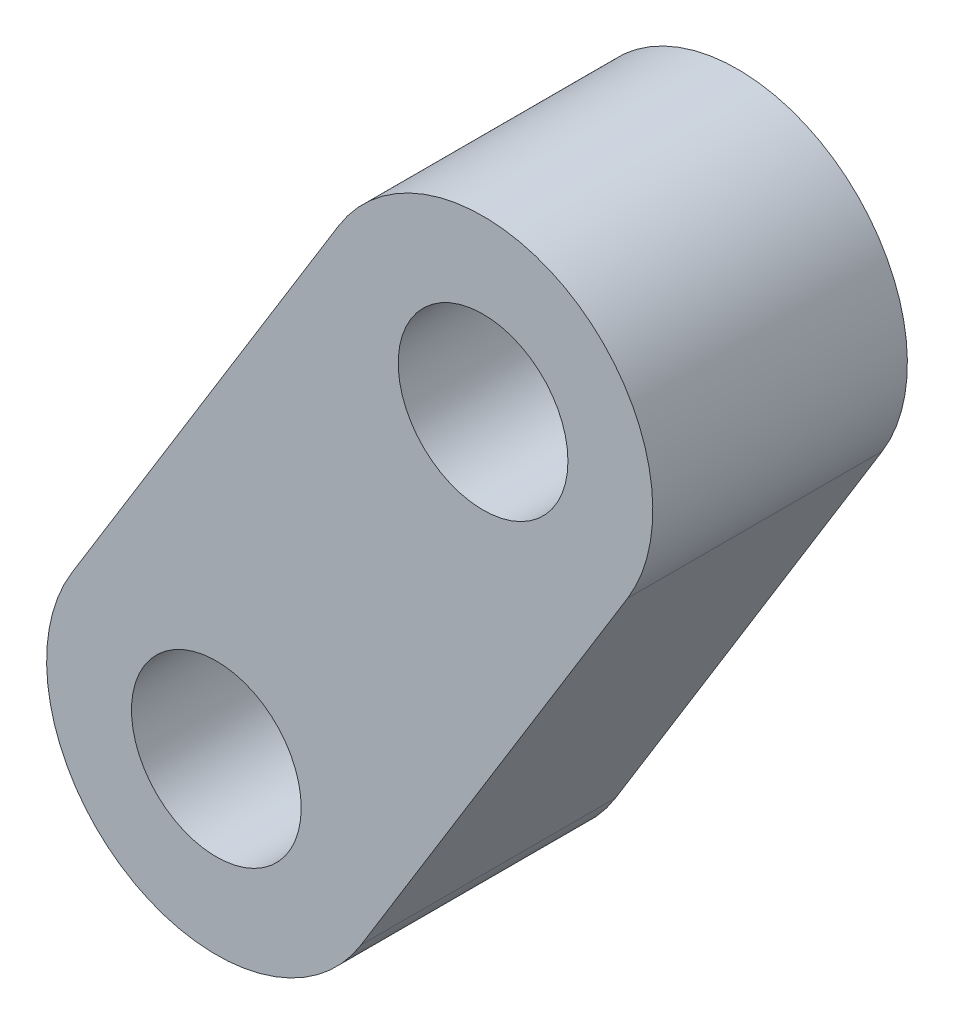
ISO-10303-21;
HEADER;
FILE_DESCRIPTION(('STEP AP214'),'2;1');
FILE_NAME('part.step','',(''),(''),'','','');
FILE_SCHEMA(('AUTOMOTIVE_DESIGN { 1 0 10303 214 1 1 1 1 }'));
ENDSEC;
DATA;
#1=APPLICATION_CONTEXT('core data for automotive mechanical design processes');
#2=APPLICATION_PROTOCOL_DEFINITION('international standard','automotive_design',2000,#1);
#3=PRODUCT_CONTEXT('',#1,'mechanical');
#4=PRODUCT('Part','Part','',(#3));
#5=PRODUCT_RELATED_PRODUCT_CATEGORY('part','',(#4));
#6=PRODUCT_DEFINITION_FORMATION('','',#4);
#7=PRODUCT_DEFINITION_CONTEXT('part definition',#1,'design');
#8=PRODUCT_DEFINITION('design','',#6,#7);
#9=PRODUCT_DEFINITION_SHAPE('','',#8);
#10=(LENGTH_UNIT() NAMED_UNIT(*) SI_UNIT(.MILLI.,.METRE.));
#11=(NAMED_UNIT(*) PLANE_ANGLE_UNIT() SI_UNIT($,.RADIAN.));
#12=(NAMED_UNIT(*) SI_UNIT($,.STERADIAN.) SOLID_ANGLE_UNIT());
#13=UNCERTAINTY_MEASURE_WITH_UNIT(LENGTH_MEASURE(1.E-05),#10,'distance_accuracy_value','');
#14=(GEOMETRIC_REPRESENTATION_CONTEXT(3) GLOBAL_UNCERTAINTY_ASSIGNED_CONTEXT((#13)) GLOBAL_UNIT_ASSIGNED_CONTEXT((#10,
#11,#12)) REPRESENTATION_CONTEXT('',''));
#15=CARTESIAN_POINT('',(0.,0.,0.));
#16=DIRECTION('',(0.,0.,1.));
#17=DIRECTION('',(1.,0.,0.));
#18=AXIS2_PLACEMENT_3D('',#15,#16,#17);
#19=CARTESIAN_POINT('',(0.826748041859817,-6.3469436973386,3.));
#20=DIRECTION('',(0.,0.,1.));
#21=DIRECTION('',(1.,0.,0.));
#22=AXIS2_PLACEMENT_3D('',#19,#20,#21);
#23=PLANE('',#22);
#24=CARTESIAN_POINT('',(0.826748041859817,-6.3469436973386,3.));
#25=DIRECTION('',(0.,0.,1.));
#26=DIRECTION('',(1.,0.,0.));
#27=AXIS2_PLACEMENT_3D('',#24,#25,#26);
#28=CIRCLE('',#27,1.);
#29=CARTESIAN_POINT('',(1.82674804185982,-6.3469436973386,3.));
#30=VERTEX_POINT('',#29);
#31=EDGE_CURVE('E104',#30,#30,#28,.T.);
#32=ORIENTED_EDGE('',*,*,#31,.F.);
#33=EDGE_LOOP('',(#32));
#34=FACE_BOUND('',#33,.T.);
#35=CARTESIAN_POINT('',(0.826748041859817,-6.3469436973386,3.));
#36=DIRECTION('',(0.,0.,1.));
#37=DIRECTION('',(1.,0.,0.));
#38=AXIS2_PLACEMENT_3D('',#35,#36,#37);
#39=CIRCLE('',#38,2.);
#40=CARTESIAN_POINT('',(-0.87687932972973,-5.2992539633186,3.));
#41=VERTEX_POINT('',#40);
#42=CARTESIAN_POINT('',(2.53037541344936,-7.39463343135859,3.));
#43=VERTEX_POINT('',#42);
#44=EDGE_CURVE('E89',#41,#43,#39,.T.);
#45=ORIENTED_EDGE('',*,*,#44,.T.);
#46=DIRECTION('',(0.523844867009998,0.851813685794774,0.));
#47=VECTOR('',#46,1.);
#48=CARTESIAN_POINT('',(2.53037541344936,-7.39463343135859,3.));
#49=LINE('',#48,#47);
#50=CARTESIAN_POINT('',(5.67344461550935,-2.28375131658995,3.));
#51=VERTEX_POINT('',#50);
#52=EDGE_CURVE('E84',#43,#51,#49,.T.);
#53=ORIENTED_EDGE('',*,*,#52,.T.);
#54=CARTESIAN_POINT('',(3.96981724391981,-1.23606158256996,3.));
#55=DIRECTION('',(0.,0.,1.));
#56=DIRECTION('',(1.,0.,0.));
#57=AXIS2_PLACEMENT_3D('',#54,#55,#56);
#58=CIRCLE('',#57,2.);
#59=CARTESIAN_POINT('',(2.26618987233026,-0.188371848549958,3.));
#60=VERTEX_POINT('',#59);
#61=EDGE_CURVE('E87',#51,#60,#58,.T.);
#62=ORIENTED_EDGE('',*,*,#61,.T.);
#63=DIRECTION('',(-0.523844867009998,-0.851813685794774,0.));
#64=VECTOR('',#63,1.);
#65=CARTESIAN_POINT('',(-0.87687932972973,-5.2992539633186,3.));
#66=LINE('',#65,#64);
#67=EDGE_CURVE('E54',#60,#41,#66,.T.);
#68=ORIENTED_EDGE('',*,*,#67,.T.);
#69=EDGE_LOOP('',(#45,#53,#62,#68));
#70=FACE_BOUND('',#69,.T.);
#71=CARTESIAN_POINT('',(3.96981724391981,-1.23606158256996,3.));
#72=DIRECTION('',(0.,0.,1.));
#73=DIRECTION('',(1.,0.,0.));
#74=AXIS2_PLACEMENT_3D('',#71,#72,#73);
#75=CIRCLE('',#74,1.);
#76=CARTESIAN_POINT('',(4.96981724391981,-1.23606158256996,3.));
#77=VERTEX_POINT('',#76);
#78=EDGE_CURVE('E119',#77,#77,#75,.T.);
#79=ORIENTED_EDGE('',*,*,#78,.F.);
#80=EDGE_LOOP('',(#79));
#81=FACE_BOUND('',#80,.T.);
#82=ADVANCED_FACE('F37',(#34,#70,#81),#23,.T.);
#83=CARTESIAN_POINT('',(0.826748041859817,-6.3469436973386,0.));
#84=DIRECTION('',(0.,0.,1.));
#85=DIRECTION('',(1.,0.,0.));
#86=AXIS2_PLACEMENT_3D('',#83,#84,#85);
#87=PLANE('',#86);
#88=CARTESIAN_POINT('',(0.826748041859817,-6.3469436973386,0.));
#89=DIRECTION('',(0.,0.,1.));
#90=DIRECTION('',(1.,0.,0.));
#91=AXIS2_PLACEMENT_3D('',#88,#89,#90);
#92=CIRCLE('',#91,2.);
#93=CARTESIAN_POINT('',(-0.87687932972973,-5.2992539633186,0.));
#94=VERTEX_POINT('',#93);
#95=CARTESIAN_POINT('',(2.53037541344936,-7.39463343135859,0.));
#96=VERTEX_POINT('',#95);
#97=EDGE_CURVE('E101',#94,#96,#92,.T.);
#98=ORIENTED_EDGE('',*,*,#97,.F.);
#99=DIRECTION('',(-0.523844867009998,-0.851813685794774,0.));
#100=VECTOR('',#99,1.);
#101=CARTESIAN_POINT('',(-0.87687932972973,-5.2992539633186,0.));
#102=LINE('',#101,#100);
#103=CARTESIAN_POINT('',(2.26618987233026,-0.188371848549958,0.));
#104=VERTEX_POINT('',#103);
#105=EDGE_CURVE('E77',#104,#94,#102,.T.);
#106=ORIENTED_EDGE('',*,*,#105,.F.);
#107=CARTESIAN_POINT('',(3.96981724391981,-1.23606158256996,0.));
#108=DIRECTION('',(0.,0.,1.));
#109=DIRECTION('',(1.,0.,0.));
#110=AXIS2_PLACEMENT_3D('',#107,#108,#109);
#111=CIRCLE('',#110,2.);
#112=CARTESIAN_POINT('',(5.67344461550935,-2.28375131658995,0.));
#113=VERTEX_POINT('',#112);
#114=EDGE_CURVE('E71',#113,#104,#111,.T.);
#115=ORIENTED_EDGE('',*,*,#114,.F.);
#116=DIRECTION('',(0.523844867009998,0.851813685794774,0.));
#117=VECTOR('',#116,1.);
#118=CARTESIAN_POINT('',(2.53037541344936,-7.39463343135859,0.));
#119=LINE('',#118,#117);
#120=EDGE_CURVE('E93',#96,#113,#119,.T.);
#121=ORIENTED_EDGE('',*,*,#120,.F.);
#122=EDGE_LOOP('',(#98,#106,#115,#121));
#123=FACE_BOUND('',#122,.T.);
#124=CARTESIAN_POINT('',(0.826748041859817,-6.3469436973386,0.));
#125=DIRECTION('',(0.,0.,1.));
#126=DIRECTION('',(1.,0.,0.));
#127=AXIS2_PLACEMENT_3D('',#124,#125,#126);
#128=CIRCLE('',#127,1.);
#129=CARTESIAN_POINT('',(1.82674804185982,-6.3469436973386,0.));
#130=VERTEX_POINT('',#129);
#131=EDGE_CURVE('E116',#130,#130,#128,.T.);
#132=ORIENTED_EDGE('',*,*,#131,.T.);
#133=EDGE_LOOP('',(#132));
#134=FACE_BOUND('',#133,.T.);
#135=CARTESIAN_POINT('',(3.96981724391981,-1.23606158256996,0.));
#136=DIRECTION('',(0.,0.,1.));
#137=DIRECTION('',(1.,0.,0.));
#138=AXIS2_PLACEMENT_3D('',#135,#136,#137);
#139=CIRCLE('',#138,1.);
#140=CARTESIAN_POINT('',(4.96981724391981,-1.23606158256996,0.));
#141=VERTEX_POINT('',#140);
#142=EDGE_CURVE('E122',#141,#141,#139,.T.);
#143=ORIENTED_EDGE('',*,*,#142,.T.);
#144=EDGE_LOOP('',(#143));
#145=FACE_BOUND('',#144,.T.);
#146=ADVANCED_FACE('F112',(#123,#134,#145),#87,.F.);
#147=CARTESIAN_POINT('',(0.826748041859817,-6.3469436973386,3.));
#148=DIRECTION('',(0.,0.,-1.));
#149=DIRECTION('',(-1.,0.,0.));
#150=AXIS2_PLACEMENT_3D('',#147,#148,#149);
#151=CYLINDRICAL_SURFACE('',#150,2.);
#152=ORIENTED_EDGE('',*,*,#97,.T.);
#153=DIRECTION('',(0.,0.,-1.));
#154=VECTOR('',#153,1.);
#155=CARTESIAN_POINT('',(2.53037541344936,-7.39463343135859,3.));
#156=LINE('',#155,#154);
#157=EDGE_CURVE('E11',#43,#96,#156,.T.);
#158=ORIENTED_EDGE('',*,*,#157,.F.);
#159=ORIENTED_EDGE('',*,*,#44,.F.);
#160=DIRECTION('',(0.,0.,-1.));
#161=VECTOR('',#160,1.);
#162=CARTESIAN_POINT('',(-0.87687932972973,-5.2992539633186,3.));
#163=LINE('',#162,#161);
#164=EDGE_CURVE('E97',#41,#94,#163,.T.);
#165=ORIENTED_EDGE('',*,*,#164,.T.);
#166=EDGE_LOOP('',(#152,#158,#159,#165));
#167=FACE_BOUND('',#166,.T.);
#168=ADVANCED_FACE('F39',(#167),#151,.T.);
#169=CARTESIAN_POINT('',(2.53037541344936,-7.39463343135859,3.));
#170=DIRECTION('',(-0.851813685794774,0.523844867009998,0.));
#171=DIRECTION('',(-0.523844867009998,-0.851813685794774,0.));
#172=AXIS2_PLACEMENT_3D('',#169,#170,#171);
#173=PLANE('',#172);
#174=ORIENTED_EDGE('',*,*,#120,.T.);
#175=DIRECTION('',(0.,0.,-1.));
#176=VECTOR('',#175,1.);
#177=CARTESIAN_POINT('',(5.67344461550935,-2.28375131658995,3.));
#178=LINE('',#177,#176);
#179=EDGE_CURVE('E46',#51,#113,#178,.T.);
#180=ORIENTED_EDGE('',*,*,#179,.F.);
#181=ORIENTED_EDGE('',*,*,#52,.F.);
#182=ORIENTED_EDGE('',*,*,#157,.T.);
#183=EDGE_LOOP('',(#174,#180,#181,#182));
#184=FACE_BOUND('',#183,.T.);
#185=ADVANCED_FACE('F92',(#184),#173,.F.);
#186=CARTESIAN_POINT('',(3.96981724391981,-1.23606158256996,3.));
#187=DIRECTION('',(0.,0.,-1.));
#188=DIRECTION('',(-1.,0.,0.));
#189=AXIS2_PLACEMENT_3D('',#186,#187,#188);
#190=CYLINDRICAL_SURFACE('',#189,2.);
#191=ORIENTED_EDGE('',*,*,#114,.T.);
#192=DIRECTION('',(0.,0.,-1.));
#193=VECTOR('',#192,1.);
#194=CARTESIAN_POINT('',(2.26618987233026,-0.188371848549958,3.));
#195=LINE('',#194,#193);
#196=EDGE_CURVE('E94',#60,#104,#195,.T.);
#197=ORIENTED_EDGE('',*,*,#196,.F.);
#198=ORIENTED_EDGE('',*,*,#61,.F.);
#199=ORIENTED_EDGE('',*,*,#179,.T.);
#200=EDGE_LOOP('',(#191,#197,#198,#199));
#201=FACE_BOUND('',#200,.T.);
#202=ADVANCED_FACE('F95',(#201),#190,.T.);
#203=CARTESIAN_POINT('',(-0.87687932972973,-5.2992539633186,3.));
#204=DIRECTION('',(0.851813685794774,-0.523844867009998,0.));
#205=DIRECTION('',(0.523844867009998,0.851813685794774,0.));
#206=AXIS2_PLACEMENT_3D('',#203,#204,#205);
#207=PLANE('',#206);
#208=ORIENTED_EDGE('',*,*,#105,.T.);
#209=ORIENTED_EDGE('',*,*,#164,.F.);
#210=ORIENTED_EDGE('',*,*,#67,.F.);
#211=ORIENTED_EDGE('',*,*,#196,.T.);
#212=EDGE_LOOP('',(#208,#209,#210,#211));
#213=FACE_BOUND('',#212,.T.);
#214=ADVANCED_FACE('F109',(#213),#207,.F.);
#215=CARTESIAN_POINT('',(0.826748041859817,-6.3469436973386,3.));
#216=DIRECTION('',(0.,0.,-1.));
#217=DIRECTION('',(-1.,0.,0.));
#218=AXIS2_PLACEMENT_3D('',#215,#216,#217);
#219=CYLINDRICAL_SURFACE('',#218,1.);
#220=ORIENTED_EDGE('',*,*,#31,.T.);
#221=EDGE_LOOP('',(#220));
#222=FACE_BOUND('',#221,.T.);
#223=ORIENTED_EDGE('',*,*,#131,.F.);
#224=EDGE_LOOP('',(#223));
#225=FACE_BOUND('',#224,.T.);
#226=ADVANCED_FACE('F139',(#222,#225),#219,.F.);
#227=CARTESIAN_POINT('',(3.96981724391981,-1.23606158256996,3.));
#228=DIRECTION('',(0.,0.,-1.));
#229=DIRECTION('',(-1.,0.,0.));
#230=AXIS2_PLACEMENT_3D('',#227,#228,#229);
#231=CYLINDRICAL_SURFACE('',#230,1.);
#232=ORIENTED_EDGE('',*,*,#78,.T.);
#233=EDGE_LOOP('',(#232));
#234=FACE_BOUND('',#233,.T.);
#235=ORIENTED_EDGE('',*,*,#142,.F.);
#236=EDGE_LOOP('',(#235));
#237=FACE_BOUND('',#236,.T.);
#238=ADVANCED_FACE('F128',(#234,#237),#231,.F.);
#239=CLOSED_SHELL('',(#82,#146,#168,#185,#202,#214,#226,#238));
#240=MANIFOLD_SOLID_BREP('B2',#239);
#241=ADVANCED_BREP_SHAPE_REPRESENTATION('',(#18,#240),#14);
#242=SHAPE_DEFINITION_REPRESENTATION(#9,#241);
ENDSEC;
END-ISO-10303-21;
